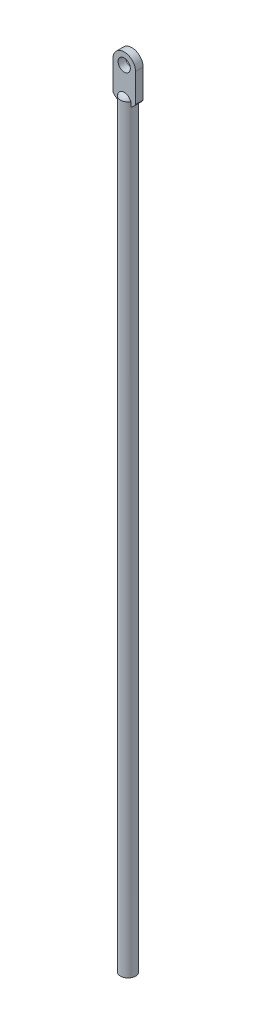
ISO-10303-21;
HEADER;
FILE_DESCRIPTION(('STEP AP214'),'2;1');
FILE_NAME('part.step','',(''),(''),'','','');
FILE_SCHEMA(('AUTOMOTIVE_DESIGN { 1 0 10303 214 1 1 1 1 }'));
ENDSEC;
DATA;
#1=APPLICATION_CONTEXT('core data for automotive mechanical design processes');
#2=APPLICATION_PROTOCOL_DEFINITION('international standard','automotive_design',2000,#1);
#3=PRODUCT_CONTEXT('',#1,'mechanical');
#4=PRODUCT('Part','Part','',(#3));
#5=PRODUCT_RELATED_PRODUCT_CATEGORY('part','',(#4));
#6=PRODUCT_DEFINITION_FORMATION('','',#4);
#7=PRODUCT_DEFINITION_CONTEXT('part definition',#1,'design');
#8=PRODUCT_DEFINITION('design','',#6,#7);
#9=PRODUCT_DEFINITION_SHAPE('','',#8);
#10=(LENGTH_UNIT() NAMED_UNIT(*) SI_UNIT(.MILLI.,.METRE.));
#11=(NAMED_UNIT(*) PLANE_ANGLE_UNIT() SI_UNIT($,.RADIAN.));
#12=(NAMED_UNIT(*) SI_UNIT($,.STERADIAN.) SOLID_ANGLE_UNIT());
#13=UNCERTAINTY_MEASURE_WITH_UNIT(LENGTH_MEASURE(1.E-05),#10,'distance_accuracy_value','');
#14=(GEOMETRIC_REPRESENTATION_CONTEXT(3) GLOBAL_UNCERTAINTY_ASSIGNED_CONTEXT((#13)) GLOBAL_UNIT_ASSIGNED_CONTEXT((#10,
#11,#12)) REPRESENTATION_CONTEXT('',''));
#15=CARTESIAN_POINT('',(0.,0.,0.));
#16=DIRECTION('',(0.,0.,1.));
#17=DIRECTION('',(1.,0.,0.));
#18=AXIS2_PLACEMENT_3D('',#15,#16,#17);
#19=CARTESIAN_POINT('',(-3.49446976022174E-13,494.82361909795,0.));
#20=DIRECTION('',(0.,-1.,0.));
#21=DIRECTION('',(1.,0.,0.));
#22=AXIS2_PLACEMENT_3D('',#19,#20,#21);
#23=SPHERICAL_SURFACE('',#22,5.17638090205075);
#24=CARTESIAN_POINT('',(0.,496.163365060105,0.));
#25=DIRECTION('',(0.,-1.,0.));
#26=DIRECTION('',(1.,0.,0.));
#27=AXIS2_PLACEMENT_3D('',#24,#25,#26);
#28=CIRCLE('',#27,5.00000000000003);
#29=CARTESIAN_POINT('',(-4.33012701892225,496.163365060105,-2.49999999999996));
#30=VERTEX_POINT('',#29);
#31=CARTESIAN_POINT('',(4.33012701892225,496.163365060105,-2.49999999999996));
#32=VERTEX_POINT('',#31);
#33=EDGE_CURVE('E160',#30,#32,#28,.T.);
#34=ORIENTED_EDGE('',*,*,#33,.F.);
#35=CARTESIAN_POINT('',(-3.49446976022174E-13,494.82361909795,-2.49999999999995));
#36=DIRECTION('',(0.,0.,1.));
#37=DIRECTION('',(1.,0.,0.));
#38=AXIS2_PLACEMENT_3D('',#35,#36,#37);
#39=CIRCLE('',#38,4.53265035526854);
#40=EDGE_CURVE('E154',#30,#32,#39,.F.);
#41=ORIENTED_EDGE('',*,*,#40,.T.);
#42=EDGE_LOOP('',(#34,#41));
#43=FACE_BOUND('',#42,.T.);
#44=ADVANCED_FACE('F40',(#43),#23,.T.);
#45=CARTESIAN_POINT('',(0.,-4.99999999999995,0.));
#46=DIRECTION('',(0.,-1.,0.));
#47=DIRECTION('',(1.,0.,0.));
#48=AXIS2_PLACEMENT_3D('',#45,#46,#47);
#49=CYLINDRICAL_SURFACE('',#48,5.);
#50=CARTESIAN_POINT('',(0.,-4.99999999999994,0.));
#51=DIRECTION('',(0.,-1.,0.));
#52=DIRECTION('',(1.,0.,0.));
#53=AXIS2_PLACEMENT_3D('',#50,#51,#52);
#54=CIRCLE('',#53,4.99999999999997);
#55=CARTESIAN_POINT('',(4.99999999999997,-4.99999999999994,0.));
#56=VERTEX_POINT('',#55);
#57=EDGE_CURVE('E159',#56,#56,#54,.T.);
#58=ORIENTED_EDGE('',*,*,#57,.F.);
#59=EDGE_LOOP('',(#58));
#60=FACE_BOUND('',#59,.T.);
#61=CARTESIAN_POINT('',(5.,493.483873135794,0.));
#62=CARTESIAN_POINT('',(4.9999995569779,493.483872539664,0.127182963144069));
#63=CARTESIAN_POINT('',(4.99513974076828,493.48047689544,0.254371622541138));
#64=CARTESIAN_POINT('',(4.97578356085683,493.467039520579,0.507657585478921));
#65=CARTESIAN_POINT('',(4.96128655902892,493.456997349843,0.633754816190569));
#66=CARTESIAN_POINT('',(4.92287380371135,493.4306716169,0.883932215149382));
#67=CARTESIAN_POINT('',(4.89895156413369,493.414383756856,1.00801093297527));
#68=CARTESIAN_POINT('',(4.84203847915344,493.376201947348,1.25320842798387));
#69=CARTESIAN_POINT('',(4.8090435835502,493.354305494404,1.37432585683515));
#70=CARTESIAN_POINT('',(4.69756447608099,493.281680715569,1.73042448758708));
#71=CARTESIAN_POINT('',(4.60628220325668,493.223794872985,1.96007309270531));
#72=CARTESIAN_POINT('',(4.39287464648707,493.095689740982,2.40056632118658));
#73=CARTESIAN_POINT('',(4.27073946912358,493.025466497604,2.61140488344317));
#74=CARTESIAN_POINT('',(3.98341054730507,492.87123539263,3.03392194505751));
#75=CARTESIAN_POINT('',(3.8149582497077,492.786560918765,3.24314184165799));
#76=CARTESIAN_POINT('',(3.4463391967002,492.618278806463,3.63243517710308));
#77=CARTESIAN_POINT('',(3.24615190728789,492.5346718969,3.8124895909707));
#78=CARTESIAN_POINT('',(2.91442078213548,492.411998677491,4.06546302676334));
#79=CARTESIAN_POINT('',(2.79272579826318,492.369874785511,4.1500329808016));
#80=CARTESIAN_POINT('',(2.54142663091063,492.289373411971,4.30850222805561));
#81=CARTESIAN_POINT('',(2.41182572575443,492.250994394467,4.38240590200648));
#82=CARTESIAN_POINT('',(2.14550776512856,492.179092205841,4.51875758734069));
#83=CARTESIAN_POINT('',(2.00879348492451,492.145567159979,4.5812100240063));
#84=CARTESIAN_POINT('',(1.72915819512006,492.084370679502,4.69390276457834));
#85=CARTESIAN_POINT('',(1.58623809655465,492.056698389159,4.74414485390855));
#86=CARTESIAN_POINT('',(1.30824375736438,492.010245512289,4.82780137950328));
#87=CARTESIAN_POINT('',(1.17359405793146,491.990894857614,4.86231133324431));
#88=CARTESIAN_POINT('',(0.90117980865367,491.958339680792,4.9200868085377));
#89=CARTESIAN_POINT('',(0.763415677349253,491.945134337882,4.94335383170557));
#90=CARTESIAN_POINT('',(0.486046292777969,491.925263457093,4.97828135607137));
#91=CARTESIAN_POINT('',(0.346442306878889,491.918593633795,4.98994946289226));
#92=CARTESIAN_POINT('',(0.0665933563889899,491.911981604493,5.00151697310749));
#93=CARTESIAN_POINT('',(-0.0736515504032257,491.912038803363,5.00141741756202));
#94=CARTESIAN_POINT('',(-0.337598112134353,491.918487201449,4.99013521011324));
#95=CARTESIAN_POINT('',(-0.461373512909622,491.924159900821,4.98020976684035));
#96=CARTESIAN_POINT('',(-0.707543134945991,491.940654079104,4.95123694911849));
#97=CARTESIAN_POINT('',(-0.829936920780852,491.951477137232,4.93218677680853));
#98=CARTESIAN_POINT('',(-1.07242258445522,491.978019521465,4.88519720873058));
#99=CARTESIAN_POINT('',(-1.19251523126092,491.993737180556,4.85726083937136));
#100=CARTESIAN_POINT('',(-1.42969872870562,492.029711900068,4.7928165679196));
#101=CARTESIAN_POINT('',(-1.54678839913426,492.049970715656,4.75630535136617));
#102=CARTESIAN_POINT('',(-1.89443652942538,492.117309624458,4.63375717696987));
#103=CARTESIAN_POINT('',(-2.11946402452865,492.170733758739,4.53508083184831));
#104=CARTESIAN_POINT('',(-2.55001407318493,492.290030857602,4.30776793956555));
#105=CARTESIAN_POINT('',(-2.75553086215721,492.355907484274,4.17912257637545));
#106=CARTESIAN_POINT('',(-3.16629808439489,492.50316096343,3.87895858870594));
#107=CARTESIAN_POINT('',(-3.36888643478713,492.585448262335,3.70423567684609));
#108=CARTESIAN_POINT('',(-3.74349470584336,492.752244056363,3.3252760388537));
#109=CARTESIAN_POINT('',(-3.9154769427702,492.836755144638,3.12100348284958));
#110=CARTESIAN_POINT('',(-4.24134071600829,493.008216613608,2.66406352936293));
#111=CARTESIAN_POINT('',(-4.39169635287281,493.09456691251,2.40859994814279));
#112=CARTESIAN_POINT('',(-4.58259494593422,493.209836043047,2.00548332240615));
#113=CARTESIAN_POINT('',(-4.64044660311187,493.245876807449,1.8678226855307));
#114=CARTESIAN_POINT('',(-4.74397901915284,493.311737545886,1.58653047668414));
#115=CARTESIAN_POINT('',(-4.78966404296683,493.341559699025,1.44290101751758));
#116=CARTESIAN_POINT('',(-4.85911313984388,493.387579309447,1.18432039289173));
#117=CARTESIAN_POINT('',(-4.88550155894482,493.405332909684,1.07034212049353));
#118=CARTESIAN_POINT('',(-4.93030064544137,493.435724654675,0.840162286194272));
#119=CARTESIAN_POINT('',(-4.94871287949872,493.448363803965,0.723961165585492));
#120=CARTESIAN_POINT('',(-4.97730721217475,493.468082857185,0.49017439008928));
#121=CARTESIAN_POINT('',(-4.98749586628555,493.475167189054,0.372589913975032));
#122=CARTESIAN_POINT('',(-4.99952269111126,493.483536555463,0.136782576611401));
#123=CARTESIAN_POINT('',(-5.00136064953965,493.484821442574,0.0185596992094404));
#124=CARTESIAN_POINT('',(-4.99665663582574,493.481542593826,-0.217683689901134));
#125=CARTESIAN_POINT('',(-4.99011135597126,493.476976549409,-0.335704103322976));
#126=CARTESIAN_POINT('',(-4.96872838978368,493.462158520736,-0.570668293769406));
#127=CARTESIAN_POINT('',(-4.95388767822966,493.451904462155,-0.687611662187594));
#128=CARTESIAN_POINT('',(-4.91610866219092,493.426067518586,-0.919613349840715));
#129=CARTESIAN_POINT('',(-4.89316836667277,493.410483323377,-1.03467119829493));
#130=CARTESIAN_POINT('',(-4.8394769321173,493.374507376932,-1.26219960856531));
#131=CARTESIAN_POINT('',(-4.80872264701304,493.354113689537,-1.37466910832285));
#132=CARTESIAN_POINT('',(-4.70439692116931,493.286098451557,-1.70990386989101));
#133=CARTESIAN_POINT('',(-4.61920004658471,493.231959083544,-1.92785116957982));
#134=CARTESIAN_POINT('',(-4.42097260084928,493.11222490085,-2.34710831791672));
#135=CARTESIAN_POINT('',(-4.30793069045409,493.046625422477,-2.54841134385274));
#136=CARTESIAN_POINT('',(-4.03544782758074,492.898184949352,-2.96425520518091));
#137=CARTESIAN_POINT('',(-3.87141501329062,492.814291911102,-3.17541834975033));
#138=CARTESIAN_POINT('',(-3.51161403440514,492.64668810403,-3.56927453031517));
#139=CARTESIAN_POINT('',(-3.31581953183818,492.562977545418,-3.75194368930417));
#140=CARTESIAN_POINT('',(-2.99024337861945,492.439223845504,-4.01001657418313));
#141=CARTESIAN_POINT('',(-2.87031165470031,492.396455138742,-4.09674723301223));
#142=CARTESIAN_POINT('',(-2.62239782709293,492.314422907548,-4.25969594360059));
#143=CARTESIAN_POINT('',(-2.49441894464943,492.275157995598,-4.33591816332605));
#144=CARTESIAN_POINT('',(-2.23116592531037,492.20125643824,-4.47707495167449));
#145=CARTESIAN_POINT('',(-2.09589445093925,492.166618119512,-4.54201360384511));
#146=CARTESIAN_POINT('',(-1.81892429142606,492.102988921134,-4.65984458987825));
#147=CARTESIAN_POINT('',(-1.67722649821791,492.073997260701,-4.71273858936662));
#148=CARTESIAN_POINT('',(-1.4002665092087,492.02466894212,-4.80194417629477));
#149=CARTESIAN_POINT('',(-1.26541678273798,492.0038204708,-4.83925387026978));
#150=CARTESIAN_POINT('',(-0.992298823275684,491.968256367946,-4.90254885018428));
#151=CARTESIAN_POINT('',(-0.854031062015655,491.953539895071,-4.92853568970016));
#152=CARTESIAN_POINT('',(-0.575356934215079,491.930682434988,-4.9687796015383));
#153=CARTESIAN_POINT('',(-0.434952123790072,491.922536876495,-4.98304482853672));
#154=CARTESIAN_POINT('',(-0.153214863401005,491.913054778121,-4.99964316599765));
#155=CARTESIAN_POINT('',(-0.0118825056063861,491.911717571659,-5.00197744457549));
#156=CARTESIAN_POINT('',(0.253833356384693,491.915644784088,-4.99510868086947));
#157=CARTESIAN_POINT('',(0.378264663482716,491.920154917278,-4.98722390170439));
#158=CARTESIAN_POINT('',(0.625933394965888,491.934402671332,-4.96222765407868));
#159=CARTESIAN_POINT('',(0.749170441741367,491.944141893978,-4.94511335841289));
#160=CARTESIAN_POINT('',(0.993503157199683,491.968618087523,-4.90187037949828));
#161=CARTESIAN_POINT('',(1.11459957665678,491.98335326809,-4.87574492539783));
#162=CARTESIAN_POINT('',(1.35392583016098,492.017480497897,-4.81478562431506));
#163=CARTESIAN_POINT('',(1.47215453670485,492.036874347135,-4.77994841110284));
#164=CARTESIAN_POINT('',(1.82165928165395,492.101477910171,-4.66281549084664));
#165=CARTESIAN_POINT('',(2.04767568824585,492.153101410756,-4.56791259625337));
#166=CARTESIAN_POINT('',(2.48073352326373,492.269202575582,-4.34800071113004));
#167=CARTESIAN_POINT('',(2.68776975713452,492.333683743511,-4.22298351257787));
#168=CARTESIAN_POINT('',(3.10157961503463,492.478297389135,-3.93079589468288));
#169=CARTESIAN_POINT('',(3.30582391397413,492.559371137661,-3.76050283428504));
#170=CARTESIAN_POINT('',(3.68445230913851,492.724505576403,-3.39044386932463));
#171=CARTESIAN_POINT('',(3.85880025384076,492.808569736519,-3.19064281847035));
#172=CARTESIAN_POINT('',(4.19129560621431,492.980580425295,-2.74203751900984));
#173=CARTESIAN_POINT('',(4.34581806581706,493.068007350516,-2.49029051394378));
#174=CARTESIAN_POINT('',(4.54355897599768,493.185924603287,-2.09237739725632));
#175=CARTESIAN_POINT('',(4.60379197840025,493.223021674894,-1.95638070901021));
#176=CARTESIAN_POINT('',(4.71229680549933,493.291342981853,-1.67824303998951));
#177=CARTESIAN_POINT('',(4.76057265491576,493.322569192455,-1.53610414562322));
#178=CARTESIAN_POINT('',(4.83486285382481,493.371410615577,-1.27970572202025));
#179=CARTESIAN_POINT('',(4.8634431408802,493.390506130871,-1.16646314390993));
#180=CARTESIAN_POINT('',(4.9127049343702,493.423728885555,-0.937563665449621));
#181=CARTESIAN_POINT('',(4.9333881122681,493.437857176232,-0.821907281465522));
#182=CARTESIAN_POINT('',(4.96658450028521,493.460661340463,-0.588958507823568));
#183=CARTESIAN_POINT('',(4.97910233613138,493.469340300999,-0.471667082964194));
#184=CARTESIAN_POINT('',(4.99580872991557,493.480945396805,-0.236251857523752));
#185=CARTESIAN_POINT('',(5.00000041148189,493.483873689484,-0.118128385788913));
#186=CARTESIAN_POINT('',(5.,493.483873135794,0.));
#187=B_SPLINE_CURVE_WITH_KNOTS('',3,(#61,#62,#63,#64,#65,#66,#67,#68,#69,#70,#71,#72,#73,#74,
#75,#76,#77,#78,#79,#80,#81,#82,#83,#84,#85,#86,#87,#88,#89,#90,#91,#92,#93,#94,#95,#96,#97,#98,
#99,#100,#101,#102,#103,#104,#105,#106,#107,#108,#109,#110,#111,#112,#113,#114,#115,#116,#117,
#118,#119,#120,#121,#122,#123,#124,#125,#126,#127,#128,#129,#130,#131,#132,#133,#134,#135,#136,
#137,#138,#139,#140,#141,#142,#143,#144,#145,#146,#147,#148,#149,#150,#151,#152,#153,#154,#155,
#156,#157,#158,#159,#160,#161,#162,#163,#164,#165,#166,#167,#168,#169,#170,#171,#172,#173,#174,
#175,#176,#177,#178,#179,#180,#181,#182,#183,#184,#185,#186),.UNSPECIFIED.,.T.,.F.,(4,2,2,2,2,2,
2,2,2,2,2,2,2,2,2,2,2,2,2,2,2,2,2,2,2,2,2,2,2,2,2,2,2,2,2,2,2,2,2,2,2,2,2,2,2,2,2,2,2,2,2,2,2,2,
2,2,2,2,2,2,2,2,4),(0.,0.381421806872508,0.762868872098956,1.14457889437614,1.52645959646004,
2.28442314709401,3.04263005862477,3.88423722051308,4.72639118056954,5.18806683823661,
5.64955233874686,6.11085912253033,6.57209841238465,6.99253088178146,7.4129071823231,
7.83300765220038,8.25307095670609,8.6255329252201,8.99810917269643,9.37055866595966,
9.74315236085227,10.4941477308715,11.2453643018685,12.0815927382821,12.9188437617517,
13.8397561895655,14.3000142609991,14.7601107783306,15.1147442192876,15.4693079724386,
15.8235888023484,16.177878638529,16.5323083072961,16.8868673157168,17.2415135423091,
17.5963027833886,18.3138871814757,19.0317642836548,19.8691841125701,20.7073019446037,
21.1689726399232,21.6304596925528,22.0917793825757,22.5530352390212,22.9768158704403,
23.4005383378098,23.8239657730754,24.2473517513228,24.621188067812,24.9951389637376,
25.3689559933551,25.7429176899328,26.4910780767935,27.2394426151251,28.0700504306341,
28.901655664286,29.8206063008996,30.2799363100104,30.7391115001076,31.0937877734843,
31.4483889361557,31.8027890397655,32.1570561620018),.UNSPECIFIED.);
#188=CARTESIAN_POINT('',(-4.33012701892222,493.060587309485,2.49999999999995));
#189=VERTEX_POINT('',#188);
#190=CARTESIAN_POINT('',(-4.33012701892313,493.060587309485,-2.50000000000029));
#191=VERTEX_POINT('',#190);
#192=EDGE_CURVE('E44',#189,#191,#187,.T.);
#193=ORIENTED_EDGE('',*,*,#192,.T.);
#194=DIRECTION('',(0.,-1.,0.));
#195=VECTOR('',#194,1.);
#196=CARTESIAN_POINT('',(-4.33012701892222,-4.99999999999995,-2.49999999999995));
#197=LINE('',#196,#195);
#198=EDGE_CURVE('E11',#191,#30,#197,.F.);
#199=ORIENTED_EDGE('',*,*,#198,.T.);
#200=ORIENTED_EDGE('',*,*,#33,.T.);
#201=DIRECTION('',(0.,-1.,0.));
#202=VECTOR('',#201,1.);
#203=CARTESIAN_POINT('',(4.33012701892222,-4.99999999999995,-2.49999999999995));
#204=LINE('',#203,#202);
#205=CARTESIAN_POINT('',(4.33012701892222,493.060587309485,-2.49999999999996));
#206=VERTEX_POINT('',#205);
#207=EDGE_CURVE('E172',#32,#206,#204,.T.);
#208=ORIENTED_EDGE('',*,*,#207,.T.);
#209=CARTESIAN_POINT('',(4.33012701892222,493.060587309485,2.49999999999995));
#210=VERTEX_POINT('',#209);
#211=EDGE_CURVE('E164',#206,#210,#187,.T.);
#212=ORIENTED_EDGE('',*,*,#211,.T.);
#213=DIRECTION('',(0.,-1.,0.));
#214=VECTOR('',#213,1.);
#215=CARTESIAN_POINT('',(4.33012701892222,-4.99999999999995,2.49999999999995));
#216=LINE('',#215,#214);
#217=CARTESIAN_POINT('',(4.33012701892225,496.163365060105,2.49999999999996));
#218=VERTEX_POINT('',#217);
#219=EDGE_CURVE('E162',#218,#210,#216,.T.);
#220=ORIENTED_EDGE('',*,*,#219,.F.);
#221=CARTESIAN_POINT('',(-4.33012701892225,496.163365060105,2.49999999999996));
#222=VERTEX_POINT('',#221);
#223=EDGE_CURVE('E158',#218,#222,#28,.T.);
#224=ORIENTED_EDGE('',*,*,#223,.T.);
#225=DIRECTION('',(0.,-1.,0.));
#226=VECTOR('',#225,1.);
#227=CARTESIAN_POINT('',(-4.33012701892222,-4.99999999999995,2.49999999999995));
#228=LINE('',#227,#226);
#229=EDGE_CURVE('E54',#189,#222,#228,.F.);
#230=ORIENTED_EDGE('',*,*,#229,.F.);
#231=EDGE_LOOP('',(#193,#199,#200,#208,#212,#220,#224,#230));
#232=FACE_BOUND('',#231,.T.);
#233=ADVANCED_FACE('F174',(#60,#232),#49,.T.);
#234=CARTESIAN_POINT('',(-3.49446976022174E-13,494.82361909795,2.49999999999995));
#235=DIRECTION('',(0.,0.,1.));
#236=DIRECTION('',(1.,0.,0.));
#237=AXIS2_PLACEMENT_3D('',#234,#235,#236);
#238=CIRCLE('',#237,4.53265035526854);
#239=EDGE_CURVE('E151',#222,#218,#238,.F.);
#240=ORIENTED_EDGE('',*,*,#239,.F.);
#241=ORIENTED_EDGE('',*,*,#223,.F.);
#242=EDGE_LOOP('',(#240,#241));
#243=FACE_BOUND('',#242,.T.);
#244=ADVANCED_FACE('F39',(#243),#23,.T.);
#245=CARTESIAN_POINT('',(4.99999999999997,-4.99999999999995,0.));
#246=DIRECTION('',(0.,-1.,0.));
#247=DIRECTION('',(1.,0.,0.));
#248=AXIS2_PLACEMENT_3D('',#245,#246,#247);
#249=PLANE('',#248);
#250=ORIENTED_EDGE('',*,*,#57,.T.);
#251=EDGE_LOOP('',(#250));
#252=FACE_BOUND('',#251,.T.);
#253=ADVANCED_FACE('F201',(#252),#249,.T.);
#254=CARTESIAN_POINT('',(0.,500.654948484777,36.5671963945108));
#255=DIRECTION('',(0.,0.,-1.));
#256=DIRECTION('',(-1.,0.,0.));
#257=AXIS2_PLACEMENT_3D('',#254,#255,#256);
#258=CYLINDRICAL_SURFACE('',#257,8.74210052909386);
#259=ORIENTED_EDGE('',*,*,#192,.F.);
#260=CARTESIAN_POINT('',(0.,500.654948484777,2.49999999999995));
#261=DIRECTION('',(0.,0.,1.));
#262=DIRECTION('',(1.,0.,0.));
#263=AXIS2_PLACEMENT_3D('',#260,#261,#262);
#264=CIRCLE('',#263,8.74210052909386);
#265=CARTESIAN_POINT('',(-7.5,496.163365060105,2.49999999999995));
#266=VERTEX_POINT('',#265);
#267=EDGE_CURVE('E128',#266,#189,#264,.T.);
#268=ORIENTED_EDGE('',*,*,#267,.F.);
#269=DIRECTION('',(0.,0.,-1.));
#270=VECTOR('',#269,1.);
#271=CARTESIAN_POINT('',(-7.5,496.163365060105,36.5671963945108));
#272=LINE('',#271,#270);
#273=CARTESIAN_POINT('',(-7.5,496.163365060105,-2.49999999999995));
#274=VERTEX_POINT('',#273);
#275=EDGE_CURVE('E149',#266,#274,#272,.T.);
#276=ORIENTED_EDGE('',*,*,#275,.T.);
#277=CARTESIAN_POINT('',(0.,500.654948484777,-2.49999999999995));
#278=DIRECTION('',(0.,0.,1.));
#279=DIRECTION('',(1.,0.,0.));
#280=AXIS2_PLACEMENT_3D('',#277,#278,#279);
#281=CIRCLE('',#280,8.74210052909386);
#282=EDGE_CURVE('E145',#274,#191,#281,.T.);
#283=ORIENTED_EDGE('',*,*,#282,.T.);
#284=EDGE_LOOP('',(#259,#268,#276,#283));
#285=FACE_BOUND('',#284,.T.);
#286=ADVANCED_FACE('F181',(#285),#258,.T.);
#287=CARTESIAN_POINT('',(7.5,496.163365060105,36.5671963945108));
#288=DIRECTION('',(-1.,0.,0.));
#289=DIRECTION('',(0.,-1.,0.));
#290=AXIS2_PLACEMENT_3D('',#287,#288,#289);
#291=PLANE('',#290);
#292=DIRECTION('',(0.,1.,0.));
#293=VECTOR('',#292,1.);
#294=CARTESIAN_POINT('',(7.5,496.163365060105,2.49999999999995));
#295=LINE('',#294,#293);
#296=CARTESIAN_POINT('',(7.5,496.163365060105,2.49999999999995));
#297=VERTEX_POINT('',#296);
#298=CARTESIAN_POINT('',(7.5,515.,2.49999999999995));
#299=VERTEX_POINT('',#298);
#300=EDGE_CURVE('E102',#297,#299,#295,.T.);
#301=ORIENTED_EDGE('',*,*,#300,.F.);
#302=DIRECTION('',(0.,0.,-1.));
#303=VECTOR('',#302,1.);
#304=CARTESIAN_POINT('',(7.5,496.163365060105,36.5671963945108));
#305=LINE('',#304,#303);
#306=CARTESIAN_POINT('',(7.5,496.163365060105,-2.49999999999995));
#307=VERTEX_POINT('',#306);
#308=EDGE_CURVE('E109',#297,#307,#305,.T.);
#309=ORIENTED_EDGE('',*,*,#308,.T.);
#310=DIRECTION('',(0.,1.,0.));
#311=VECTOR('',#310,1.);
#312=CARTESIAN_POINT('',(7.5,496.163365060105,-2.49999999999995));
#313=LINE('',#312,#311);
#314=CARTESIAN_POINT('',(7.5,515.,-2.49999999999995));
#315=VERTEX_POINT('',#314);
#316=EDGE_CURVE('E106',#307,#315,#313,.T.);
#317=ORIENTED_EDGE('',*,*,#316,.T.);
#318=DIRECTION('',(0.,0.,-1.));
#319=VECTOR('',#318,1.);
#320=CARTESIAN_POINT('',(7.5,515.,36.5671963945108));
#321=LINE('',#320,#319);
#322=EDGE_CURVE('E97',#299,#315,#321,.T.);
#323=ORIENTED_EDGE('',*,*,#322,.F.);
#324=EDGE_LOOP('',(#301,#309,#317,#323));
#325=FACE_BOUND('',#324,.T.);
#326=ADVANCED_FACE('F101',(#325),#291,.F.);
#327=ORIENTED_EDGE('',*,*,#211,.F.);
#328=EDGE_CURVE('E141',#206,#307,#281,.T.);
#329=ORIENTED_EDGE('',*,*,#328,.T.);
#330=ORIENTED_EDGE('',*,*,#308,.F.);
#331=EDGE_CURVE('E127',#210,#297,#264,.T.);
#332=ORIENTED_EDGE('',*,*,#331,.F.);
#333=EDGE_LOOP('',(#327,#329,#330,#332));
#334=FACE_BOUND('',#333,.T.);
#335=ADVANCED_FACE('F178',(#334),#258,.T.);
#336=CARTESIAN_POINT('',(-7.5,515.,36.5671963945108));
#337=DIRECTION('',(1.,0.,0.));
#338=DIRECTION('',(0.,0.,-1.));
#339=AXIS2_PLACEMENT_3D('',#336,#337,#338);
#340=PLANE('',#339);
#341=DIRECTION('',(0.,-1.,0.));
#342=VECTOR('',#341,1.);
#343=CARTESIAN_POINT('',(-7.5,515.,2.49999999999995));
#344=LINE('',#343,#342);
#345=CARTESIAN_POINT('',(-7.5,515.,2.49999999999995));
#346=VERTEX_POINT('',#345);
#347=EDGE_CURVE('E120',#346,#266,#344,.T.);
#348=ORIENTED_EDGE('',*,*,#347,.F.);
#349=DIRECTION('',(0.,0.,-1.));
#350=VECTOR('',#349,1.);
#351=CARTESIAN_POINT('',(-7.5,515.,36.5671963945108));
#352=LINE('',#351,#350);
#353=CARTESIAN_POINT('',(-7.5,515.,-2.49999999999995));
#354=VERTEX_POINT('',#353);
#355=EDGE_CURVE('E116',#346,#354,#352,.T.);
#356=ORIENTED_EDGE('',*,*,#355,.T.);
#357=DIRECTION('',(0.,-1.,0.));
#358=VECTOR('',#357,1.);
#359=CARTESIAN_POINT('',(-7.5,515.,-2.49999999999995));
#360=LINE('',#359,#358);
#361=EDGE_CURVE('E139',#354,#274,#360,.T.);
#362=ORIENTED_EDGE('',*,*,#361,.T.);
#363=ORIENTED_EDGE('',*,*,#275,.F.);
#364=EDGE_LOOP('',(#348,#356,#362,#363));
#365=FACE_BOUND('',#364,.T.);
#366=ADVANCED_FACE('F182',(#365),#340,.F.);
#367=CARTESIAN_POINT('',(0.,515.,36.5671963945108));
#368=DIRECTION('',(0.,0.,-1.));
#369=DIRECTION('',(-1.,0.,0.));
#370=AXIS2_PLACEMENT_3D('',#367,#368,#369);
#371=CYLINDRICAL_SURFACE('',#370,7.5);
#372=CARTESIAN_POINT('',(0.,515.,2.49999999999995));
#373=DIRECTION('',(0.,0.,1.));
#374=DIRECTION('',(1.,0.,0.));
#375=AXIS2_PLACEMENT_3D('',#372,#373,#374);
#376=CIRCLE('',#375,7.5);
#377=EDGE_CURVE('E111',#299,#346,#376,.T.);
#378=ORIENTED_EDGE('',*,*,#377,.F.);
#379=ORIENTED_EDGE('',*,*,#322,.T.);
#380=CARTESIAN_POINT('',(0.,515.,-2.49999999999995));
#381=DIRECTION('',(0.,0.,1.));
#382=DIRECTION('',(1.,0.,0.));
#383=AXIS2_PLACEMENT_3D('',#380,#381,#382);
#384=CIRCLE('',#383,7.5);
#385=EDGE_CURVE('E136',#315,#354,#384,.T.);
#386=ORIENTED_EDGE('',*,*,#385,.T.);
#387=ORIENTED_EDGE('',*,*,#355,.F.);
#388=EDGE_LOOP('',(#378,#379,#386,#387));
#389=FACE_BOUND('',#388,.T.);
#390=ADVANCED_FACE('F113',(#389),#371,.T.);
#391=CARTESIAN_POINT('',(0.,515.,-2.49999999999995));
#392=DIRECTION('',(0.,0.,1.));
#393=DIRECTION('',(1.,0.,0.));
#394=AXIS2_PLACEMENT_3D('',#391,#392,#393);
#395=PLANE('',#394);
#396=ORIENTED_EDGE('',*,*,#198,.F.);
#397=ORIENTED_EDGE('',*,*,#282,.F.);
#398=ORIENTED_EDGE('',*,*,#361,.F.);
#399=ORIENTED_EDGE('',*,*,#385,.F.);
#400=ORIENTED_EDGE('',*,*,#316,.F.);
#401=ORIENTED_EDGE('',*,*,#328,.F.);
#402=ORIENTED_EDGE('',*,*,#207,.F.);
#403=ORIENTED_EDGE('',*,*,#40,.F.);
#404=EDGE_LOOP('',(#396,#397,#398,#399,#400,#401,#402,#403));
#405=FACE_BOUND('',#404,.T.);
#406=CARTESIAN_POINT('',(0.,515.,-2.49999999999995));
#407=DIRECTION('',(0.,0.,1.));
#408=DIRECTION('',(1.,0.,0.));
#409=AXIS2_PLACEMENT_3D('',#406,#407,#408);
#410=CIRCLE('',#409,4.04999999999998);
#411=CARTESIAN_POINT('',(4.04999999999998,515.,-2.49999999999995));
#412=VERTEX_POINT('',#411);
#413=EDGE_CURVE('E118',#412,#412,#410,.T.);
#414=ORIENTED_EDGE('',*,*,#413,.T.);
#415=EDGE_LOOP('',(#414));
#416=FACE_BOUND('',#415,.T.);
#417=ADVANCED_FACE('F189',(#405,#416),#395,.F.);
#418=CARTESIAN_POINT('',(0.,515.,36.5671963945108));
#419=DIRECTION('',(0.,0.,-1.));
#420=DIRECTION('',(-1.,0.,0.));
#421=AXIS2_PLACEMENT_3D('',#418,#419,#420);
#422=CYLINDRICAL_SURFACE('',#421,4.04999999999998);
#423=ORIENTED_EDGE('',*,*,#413,.F.);
#424=EDGE_LOOP('',(#423));
#425=FACE_BOUND('',#424,.T.);
#426=CARTESIAN_POINT('',(0.,515.,2.49999999999995));
#427=DIRECTION('',(0.,0.,1.));
#428=DIRECTION('',(1.,0.,0.));
#429=AXIS2_PLACEMENT_3D('',#426,#427,#428);
#430=CIRCLE('',#429,4.04999999999998);
#431=CARTESIAN_POINT('',(4.04999999999998,515.,2.49999999999995));
#432=VERTEX_POINT('',#431);
#433=EDGE_CURVE('E126',#432,#432,#430,.T.);
#434=ORIENTED_EDGE('',*,*,#433,.T.);
#435=EDGE_LOOP('',(#434));
#436=FACE_BOUND('',#435,.T.);
#437=ADVANCED_FACE('F195',(#425,#436),#422,.F.);
#438=CARTESIAN_POINT('',(0.,0.,2.49999999999995));
#439=DIRECTION('',(0.,0.,1.));
#440=DIRECTION('',(1.,0.,0.));
#441=AXIS2_PLACEMENT_3D('',#438,#439,#440);
#442=PLANE('',#441);
#443=ORIENTED_EDGE('',*,*,#433,.F.);
#444=EDGE_LOOP('',(#443));
#445=FACE_BOUND('',#444,.T.);
#446=ORIENTED_EDGE('',*,*,#267,.T.);
#447=ORIENTED_EDGE('',*,*,#229,.T.);
#448=ORIENTED_EDGE('',*,*,#239,.T.);
#449=ORIENTED_EDGE('',*,*,#219,.T.);
#450=ORIENTED_EDGE('',*,*,#331,.T.);
#451=ORIENTED_EDGE('',*,*,#300,.T.);
#452=ORIENTED_EDGE('',*,*,#377,.T.);
#453=ORIENTED_EDGE('',*,*,#347,.T.);
#454=EDGE_LOOP('',(#446,#447,#448,#449,#450,#451,#452,#453));
#455=FACE_BOUND('',#454,.T.);
#456=ADVANCED_FACE('F121',(#445,#455),#442,.T.);
#457=CLOSED_SHELL('',(#44,#233,#244,#253,#286,#326,#335,#366,#390,#417,#437,#456));
#458=MANIFOLD_SOLID_BREP('B2',#457);
#459=ADVANCED_BREP_SHAPE_REPRESENTATION('',(#18,#458),#14);
#460=SHAPE_DEFINITION_REPRESENTATION(#9,#459);
ENDSEC;
END-ISO-10303-21;
